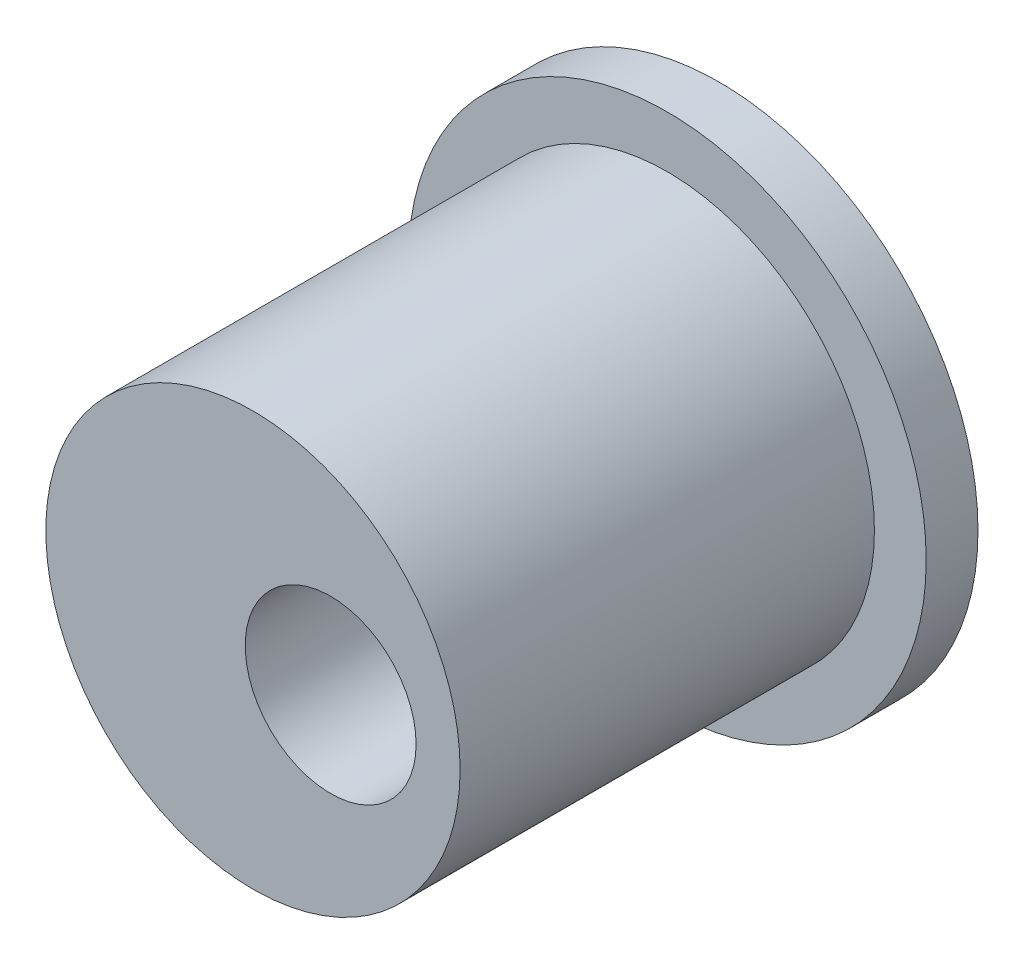
ISO-10303-21;
HEADER;
FILE_DESCRIPTION(('STEP AP214'),'2;1');
FILE_NAME('part.step','',(''),(''),'','','');
FILE_SCHEMA(('AUTOMOTIVE_DESIGN { 1 0 10303 214 1 1 1 1 }'));
ENDSEC;
DATA;
#1=APPLICATION_CONTEXT('core data for automotive mechanical design processes');
#2=APPLICATION_PROTOCOL_DEFINITION('international standard','automotive_design',2000,#1);
#3=PRODUCT_CONTEXT('',#1,'mechanical');
#4=PRODUCT('Part','Part','',(#3));
#5=PRODUCT_RELATED_PRODUCT_CATEGORY('part','',(#4));
#6=PRODUCT_DEFINITION_FORMATION('','',#4);
#7=PRODUCT_DEFINITION_CONTEXT('part definition',#1,'design');
#8=PRODUCT_DEFINITION('design','',#6,#7);
#9=PRODUCT_DEFINITION_SHAPE('','',#8);
#10=(LENGTH_UNIT() NAMED_UNIT(*) SI_UNIT(.MILLI.,.METRE.));
#11=(NAMED_UNIT(*) PLANE_ANGLE_UNIT() SI_UNIT($,.RADIAN.));
#12=(NAMED_UNIT(*) SI_UNIT($,.STERADIAN.) SOLID_ANGLE_UNIT());
#13=UNCERTAINTY_MEASURE_WITH_UNIT(LENGTH_MEASURE(1.E-05),#10,'distance_accuracy_value','');
#14=(GEOMETRIC_REPRESENTATION_CONTEXT(3) GLOBAL_UNCERTAINTY_ASSIGNED_CONTEXT((#13)) GLOBAL_UNIT_ASSIGNED_CONTEXT((#10,
#11,#12)) REPRESENTATION_CONTEXT('',''));
#15=CARTESIAN_POINT('',(0.,0.,0.));
#16=DIRECTION('',(0.,0.,1.));
#17=DIRECTION('',(1.,0.,0.));
#18=AXIS2_PLACEMENT_3D('',#15,#16,#17);
#19=CARTESIAN_POINT('',(0.,0.,1.));
#20=DIRECTION('',(0.,0.,-1.));
#21=DIRECTION('',(-1.,0.,0.));
#22=AXIS2_PLACEMENT_3D('',#19,#20,#21);
#23=CYLINDRICAL_SURFACE('',#22,5.);
#24=CARTESIAN_POINT('',(0.,0.,1.));
#25=DIRECTION('',(0.,0.,1.));
#26=DIRECTION('',(1.,0.,0.));
#27=AXIS2_PLACEMENT_3D('',#24,#25,#26);
#28=CIRCLE('',#27,5.);
#29=CARTESIAN_POINT('',(5.,0.,1.));
#30=VERTEX_POINT('',#29);
#31=EDGE_CURVE('E10',#30,#30,#28,.T.);
#32=ORIENTED_EDGE('',*,*,#31,.F.);
#33=EDGE_LOOP('',(#32));
#34=FACE_BOUND('',#33,.T.);
#35=CARTESIAN_POINT('',(0.,0.,0.));
#36=DIRECTION('',(0.,0.,1.));
#37=DIRECTION('',(1.,0.,0.));
#38=AXIS2_PLACEMENT_3D('',#35,#36,#37);
#39=CIRCLE('',#38,5.);
#40=CARTESIAN_POINT('',(5.,0.,0.));
#41=VERTEX_POINT('',#40);
#42=EDGE_CURVE('E34',#41,#41,#39,.T.);
#43=ORIENTED_EDGE('',*,*,#42,.T.);
#44=EDGE_LOOP('',(#43));
#45=FACE_BOUND('',#44,.T.);
#46=ADVANCED_FACE('F31',(#34,#45),#23,.T.);
#47=CARTESIAN_POINT('',(0.,0.,1.));
#48=DIRECTION('',(0.,0.,1.));
#49=DIRECTION('',(1.,0.,0.));
#50=AXIS2_PLACEMENT_3D('',#47,#48,#49);
#51=PLANE('',#50);
#52=CARTESIAN_POINT('',(0.,0.,1.));
#53=DIRECTION('',(0.,0.,1.));
#54=DIRECTION('',(1.,0.,0.));
#55=AXIS2_PLACEMENT_3D('',#52,#53,#54);
#56=CIRCLE('',#55,4.);
#57=CARTESIAN_POINT('',(4.,0.,1.));
#58=VERTEX_POINT('',#57);
#59=EDGE_CURVE('E43',#58,#58,#56,.T.);
#60=ORIENTED_EDGE('',*,*,#59,.F.);
#61=EDGE_LOOP('',(#60));
#62=FACE_BOUND('',#61,.T.);
#63=ORIENTED_EDGE('',*,*,#31,.T.);
#64=EDGE_LOOP('',(#63));
#65=FACE_BOUND('',#64,.T.);
#66=ADVANCED_FACE('F76',(#62,#65),#51,.T.);
#67=CARTESIAN_POINT('',(0.,0.,0.));
#68=DIRECTION('',(0.,0.,1.));
#69=DIRECTION('',(1.,0.,0.));
#70=AXIS2_PLACEMENT_3D('',#67,#68,#69);
#71=PLANE('',#70);
#72=ORIENTED_EDGE('',*,*,#42,.F.);
#73=EDGE_LOOP('',(#72));
#74=FACE_BOUND('',#73,.T.);
#75=ADVANCED_FACE('F72',(#74),#71,.F.);
#76=CARTESIAN_POINT('',(0.,0.,9.));
#77=DIRECTION('',(0.,0.,-1.));
#78=DIRECTION('',(-1.,0.,0.));
#79=AXIS2_PLACEMENT_3D('',#76,#77,#78);
#80=CYLINDRICAL_SURFACE('',#79,4.);
#81=CARTESIAN_POINT('',(0.,0.,9.));
#82=DIRECTION('',(0.,0.,1.));
#83=DIRECTION('',(1.,0.,0.));
#84=AXIS2_PLACEMENT_3D('',#81,#82,#83);
#85=CIRCLE('',#84,4.);
#86=CARTESIAN_POINT('',(4.,0.,9.));
#87=VERTEX_POINT('',#86);
#88=EDGE_CURVE('E41',#87,#87,#85,.T.);
#89=ORIENTED_EDGE('',*,*,#88,.F.);
#90=EDGE_LOOP('',(#89));
#91=FACE_BOUND('',#90,.T.);
#92=ORIENTED_EDGE('',*,*,#59,.T.);
#93=EDGE_LOOP('',(#92));
#94=FACE_BOUND('',#93,.T.);
#95=ADVANCED_FACE('F66',(#91,#94),#80,.T.);
#96=CARTESIAN_POINT('',(0.,0.,9.));
#97=DIRECTION('',(0.,0.,1.));
#98=DIRECTION('',(1.,0.,0.));
#99=AXIS2_PLACEMENT_3D('',#96,#97,#98);
#100=PLANE('',#99);
#101=CARTESIAN_POINT('',(1.5,0.,9.));
#102=DIRECTION('',(0.,0.,1.));
#103=DIRECTION('',(1.,0.,0.));
#104=AXIS2_PLACEMENT_3D('',#101,#102,#103);
#105=CIRCLE('',#104,1.65);
#106=CARTESIAN_POINT('',(3.15,0.,9.));
#107=VERTEX_POINT('',#106);
#108=EDGE_CURVE('E49',#107,#107,#105,.T.);
#109=ORIENTED_EDGE('',*,*,#108,.F.);
#110=EDGE_LOOP('',(#109));
#111=FACE_BOUND('',#110,.T.);
#112=ORIENTED_EDGE('',*,*,#88,.T.);
#113=EDGE_LOOP('',(#112));
#114=FACE_BOUND('',#113,.T.);
#115=ADVANCED_FACE('F60',(#111,#114),#100,.T.);
#116=CARTESIAN_POINT('',(1.5,0.,2.));
#117=DIRECTION('',(0.,0.,1.));
#118=DIRECTION('',(1.,0.,0.));
#119=AXIS2_PLACEMENT_3D('',#116,#117,#118);
#120=CYLINDRICAL_SURFACE('',#119,1.65);
#121=CARTESIAN_POINT('',(1.5,0.,2.));
#122=DIRECTION('',(0.,0.,1.));
#123=DIRECTION('',(1.,0.,0.));
#124=AXIS2_PLACEMENT_3D('',#121,#122,#123);
#125=CIRCLE('',#124,1.65);
#126=CARTESIAN_POINT('',(3.15,0.,2.));
#127=VERTEX_POINT('',#126);
#128=EDGE_CURVE('E46',#127,#127,#125,.T.);
#129=ORIENTED_EDGE('',*,*,#128,.F.);
#130=EDGE_LOOP('',(#129));
#131=FACE_BOUND('',#130,.T.);
#132=ORIENTED_EDGE('',*,*,#108,.T.);
#133=EDGE_LOOP('',(#132));
#134=FACE_BOUND('',#133,.T.);
#135=ADVANCED_FACE('F57',(#131,#134),#120,.F.);
#136=CARTESIAN_POINT('',(1.5,0.,2.));
#137=DIRECTION('',(0.,0.,1.));
#138=DIRECTION('',(1.,0.,0.));
#139=AXIS2_PLACEMENT_3D('',#136,#137,#138);
#140=PLANE('',#139);
#141=ORIENTED_EDGE('',*,*,#128,.T.);
#142=EDGE_LOOP('',(#141));
#143=FACE_BOUND('',#142,.T.);
#144=ADVANCED_FACE('F55',(#143),#140,.T.);
#145=CLOSED_SHELL('',(#46,#66,#75,#95,#115,#135,#144));
#146=MANIFOLD_SOLID_BREP('B2',#145);
#147=ADVANCED_BREP_SHAPE_REPRESENTATION('',(#18,#146),#14);
#148=SHAPE_DEFINITION_REPRESENTATION(#9,#147);
ENDSEC;
END-ISO-10303-21;
